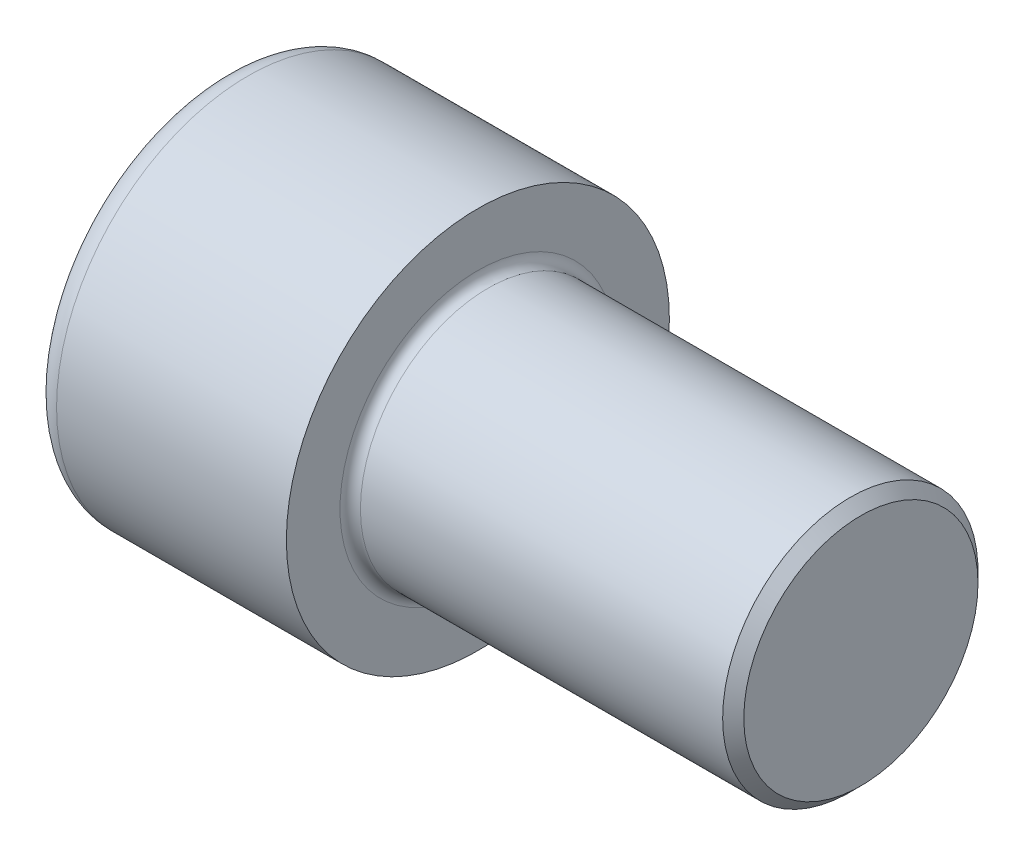
ISO-10303-21;
HEADER;
FILE_DESCRIPTION(('STEP AP214'),'2;1');
FILE_NAME('part.step','',(''),(''),'','','');
FILE_SCHEMA(('AUTOMOTIVE_DESIGN { 1 0 10303 214 1 1 1 1 }'));
ENDSEC;
DATA;
#1=APPLICATION_CONTEXT('core data for automotive mechanical design processes');
#2=APPLICATION_PROTOCOL_DEFINITION('international standard','automotive_design',2000,#1);
#3=PRODUCT_CONTEXT('',#1,'mechanical');
#4=PRODUCT('Part','Part','',(#3));
#5=PRODUCT_RELATED_PRODUCT_CATEGORY('part','',(#4));
#6=PRODUCT_DEFINITION_FORMATION('','',#4);
#7=PRODUCT_DEFINITION_CONTEXT('part definition',#1,'design');
#8=PRODUCT_DEFINITION('design','',#6,#7);
#9=PRODUCT_DEFINITION_SHAPE('','',#8);
#10=(LENGTH_UNIT() NAMED_UNIT(*) SI_UNIT(.MILLI.,.METRE.));
#11=(NAMED_UNIT(*) PLANE_ANGLE_UNIT() SI_UNIT($,.RADIAN.));
#12=(NAMED_UNIT(*) SI_UNIT($,.STERADIAN.) SOLID_ANGLE_UNIT());
#13=UNCERTAINTY_MEASURE_WITH_UNIT(LENGTH_MEASURE(1.E-05),#10,'distance_accuracy_value','');
#14=(GEOMETRIC_REPRESENTATION_CONTEXT(3) GLOBAL_UNCERTAINTY_ASSIGNED_CONTEXT((#13)) GLOBAL_UNIT_ASSIGNED_CONTEXT((#10,
#11,#12)) REPRESENTATION_CONTEXT('',''));
#15=CARTESIAN_POINT('',(0.,0.,0.));
#16=DIRECTION('',(0.,0.,1.));
#17=DIRECTION('',(1.,0.,0.));
#18=AXIS2_PLACEMENT_3D('',#15,#16,#17);
#19=CARTESIAN_POINT('',(-14.6144853716993,11.3751640071104,0.));
#20=DIRECTION('',(-1.,0.,0.));
#21=DIRECTION('',(0.,0.,1.));
#22=AXIS2_PLACEMENT_3D('',#19,#20,#21);
#23=PLANE('',#22);
#24=DIRECTION('',(0.,-0.499999999999999,0.866025403784439));
#25=VECTOR('',#24,1.);
#26=CARTESIAN_POINT('',(-14.6144853716993,21.2189860967935,0.));
#27=LINE('',#26,#25);
#28=CARTESIAN_POINT('',(-14.6144853716993,21.2189860967935,0.));
#29=VERTEX_POINT('',#28);
#30=CARTESIAN_POINT('',(-14.6144853716993,16.297075051952,8.52499999999997));
#31=VERTEX_POINT('',#30);
#32=EDGE_CURVE('E289',#29,#31,#27,.T.);
#33=ORIENTED_EDGE('',*,*,#32,.T.);
#34=DIRECTION('',(0.,1.,0.));
#35=VECTOR('',#34,1.);
#36=CARTESIAN_POINT('',(-14.6144853716993,6.45325296226885,8.52499999999998));
#37=LINE('',#36,#35);
#38=CARTESIAN_POINT('',(-14.6144853716993,6.45325296226885,8.52499999999998));
#39=VERTEX_POINT('',#38);
#40=EDGE_CURVE('E146',#39,#31,#37,.T.);
#41=ORIENTED_EDGE('',*,*,#40,.F.);
#42=DIRECTION('',(0.,-0.500000000000001,-0.866025403784438));
#43=VECTOR('',#42,1.);
#44=CARTESIAN_POINT('',(-14.6144853716993,6.45325296226885,8.52499999999998));
#45=LINE('',#44,#43);
#46=CARTESIAN_POINT('',(-14.6144853716993,1.53134191742728,0.));
#47=VERTEX_POINT('',#46);
#48=EDGE_CURVE('E294',#39,#47,#45,.T.);
#49=ORIENTED_EDGE('',*,*,#48,.T.);
#50=DIRECTION('',(0.,0.499999999999999,-0.866025403784439));
#51=VECTOR('',#50,1.);
#52=CARTESIAN_POINT('',(-14.6144853716993,1.53134191742728,0.));
#53=LINE('',#52,#51);
#54=CARTESIAN_POINT('',(-14.6144853716993,6.45325296226883,-8.52500000000001));
#55=VERTEX_POINT('',#54);
#56=EDGE_CURVE('E298',#47,#55,#53,.T.);
#57=ORIENTED_EDGE('',*,*,#56,.T.);
#58=DIRECTION('',(0.,-1.,0.));
#59=VECTOR('',#58,1.);
#60=CARTESIAN_POINT('',(-14.6144853716993,16.2970750519519,-8.52500000000003));
#61=LINE('',#60,#59);
#62=CARTESIAN_POINT('',(-14.6144853716993,16.2970750519519,-8.52500000000003));
#63=VERTEX_POINT('',#62);
#64=EDGE_CURVE('E302',#63,#55,#61,.T.);
#65=ORIENTED_EDGE('',*,*,#64,.F.);
#66=DIRECTION('',(0.,-0.500000000000001,-0.866025403784438));
#67=VECTOR('',#66,1.);
#68=CARTESIAN_POINT('',(-14.6144853716993,21.2189860967935,0.));
#69=LINE('',#68,#67);
#70=EDGE_CURVE('E141',#29,#63,#69,.T.);
#71=ORIENTED_EDGE('',*,*,#70,.F.);
#72=EDGE_LOOP('',(#33,#41,#49,#57,#65,#71));
#73=FACE_BOUND('',#72,.T.);
#74=CARTESIAN_POINT('',(-14.6144853716993,11.3751640071104,0.));
#75=DIRECTION('',(-1.,0.,0.));
#76=DIRECTION('',(0.,0.,1.));
#77=AXIS2_PLACEMENT_3D('',#74,#75,#76);
#78=CIRCLE('',#77,13.);
#79=CARTESIAN_POINT('',(-14.6144853716993,11.3751640071104,13.));
#80=VERTEX_POINT('',#79);
#81=EDGE_CURVE('E56',#80,#80,#78,.T.);
#82=ORIENTED_EDGE('',*,*,#81,.T.);
#83=EDGE_LOOP('',(#82));
#84=FACE_BOUND('',#83,.T.);
#85=ADVANCED_FACE('F47',(#73,#84),#23,.T.);
#86=CARTESIAN_POINT('',(-46.3644853716993,11.3751640071104,0.));
#87=DIRECTION('',(-1.,0.,0.));
#88=DIRECTION('',(0.,0.,1.));
#89=AXIS2_PLACEMENT_3D('',#86,#87,#88);
#90=CYLINDRICAL_SURFACE('',#89,15.);
#91=CARTESIAN_POINT('',(-12.6144853716993,11.3751640071104,0.));
#92=DIRECTION('',(-1.,0.,0.));
#93=DIRECTION('',(0.,0.,1.));
#94=AXIS2_PLACEMENT_3D('',#91,#92,#93);
#95=CIRCLE('',#94,15.);
#96=CARTESIAN_POINT('',(-12.6144853716993,11.3751640071104,15.));
#97=VERTEX_POINT('',#96);
#98=EDGE_CURVE('E11',#97,#97,#95,.F.);
#99=ORIENTED_EDGE('',*,*,#98,.T.);
#100=EDGE_LOOP('',(#99));
#101=FACE_BOUND('',#100,.T.);
#102=CARTESIAN_POINT('',(5.38551462830068,11.3751640071104,0.));
#103=DIRECTION('',(-1.,0.,0.));
#104=DIRECTION('',(0.,0.,1.));
#105=AXIS2_PLACEMENT_3D('',#102,#103,#104);
#106=CIRCLE('',#105,15.);
#107=CARTESIAN_POINT('',(5.38551462830068,11.3751640071104,15.));
#108=VERTEX_POINT('',#107);
#109=EDGE_CURVE('E170',#108,#108,#106,.T.);
#110=ORIENTED_EDGE('',*,*,#109,.T.);
#111=EDGE_LOOP('',(#110));
#112=FACE_BOUND('',#111,.T.);
#113=ADVANCED_FACE('F198',(#101,#112),#90,.T.);
#114=CARTESIAN_POINT('',(5.38551462830068,26.3751640071104,0.));
#115=DIRECTION('',(1.,0.,0.));
#116=DIRECTION('',(0.,0.,-1.));
#117=AXIS2_PLACEMENT_3D('',#114,#115,#116);
#118=PLANE('',#117);
#119=CARTESIAN_POINT('',(5.38551462830068,11.3751640071104,0.));
#120=DIRECTION('',(1.,0.,0.));
#121=DIRECTION('',(0.,0.,-1.));
#122=AXIS2_PLACEMENT_3D('',#119,#120,#121);
#123=CIRCLE('',#122,10.8);
#124=CARTESIAN_POINT('',(5.38551462830068,11.3751640071104,-10.8));
#125=VERTEX_POINT('',#124);
#126=EDGE_CURVE('E174',#125,#125,#123,.F.);
#127=ORIENTED_EDGE('',*,*,#126,.T.);
#128=EDGE_LOOP('',(#127));
#129=FACE_BOUND('',#128,.T.);
#130=ORIENTED_EDGE('',*,*,#109,.F.);
#131=EDGE_LOOP('',(#130));
#132=FACE_BOUND('',#131,.T.);
#133=ADVANCED_FACE('F204',(#129,#132),#118,.T.);
#134=CARTESIAN_POINT('',(-46.3644853716993,11.3751640071104,0.));
#135=DIRECTION('',(-1.,0.,0.));
#136=DIRECTION('',(0.,0.,1.));
#137=AXIS2_PLACEMENT_3D('',#134,#135,#136);
#138=CYLINDRICAL_SURFACE('',#137,10.);
#139=CARTESIAN_POINT('',(6.18551462830068,11.3751640071104,0.));
#140=DIRECTION('',(1.,0.,0.));
#141=DIRECTION('',(0.,0.,-1.));
#142=AXIS2_PLACEMENT_3D('',#139,#140,#141);
#143=CIRCLE('',#142,10.);
#144=CARTESIAN_POINT('',(6.18551462830068,11.3751640071104,-10.));
#145=VERTEX_POINT('',#144);
#146=EDGE_CURVE('E178',#145,#145,#143,.T.);
#147=ORIENTED_EDGE('',*,*,#146,.T.);
#148=EDGE_LOOP('',(#147));
#149=FACE_BOUND('',#148,.T.);
#150=CARTESIAN_POINT('',(34.5575146283007,11.3751640071104,0.));
#151=DIRECTION('',(-1.,0.,0.));
#152=DIRECTION('',(0.,0.,1.));
#153=AXIS2_PLACEMENT_3D('',#150,#151,#152);
#154=CIRCLE('',#153,10.);
#155=CARTESIAN_POINT('',(34.5575146283007,11.3751640071104,9.99999999999998));
#156=VERTEX_POINT('',#155);
#157=EDGE_CURVE('E166',#156,#156,#154,.T.);
#158=ORIENTED_EDGE('',*,*,#157,.T.);
#159=EDGE_LOOP('',(#158));
#160=FACE_BOUND('',#159,.T.);
#161=ADVANCED_FACE('F210',(#149,#160),#138,.T.);
#162=CARTESIAN_POINT('',(35.3855146283007,11.3751640071104,0.));
#163=DIRECTION('',(-1.,0.,0.));
#164=DIRECTION('',(0.,0.,1.));
#165=AXIS2_PLACEMENT_3D('',#162,#163,#164);
#166=CONICAL_SURFACE('',#165,9.172,0.78539816339745);
#167=ORIENTED_EDGE('',*,*,#157,.F.);
#168=EDGE_LOOP('',(#167));
#169=FACE_BOUND('',#168,.T.);
#170=CARTESIAN_POINT('',(35.3855146283007,11.3751640071104,0.));
#171=DIRECTION('',(-1.,0.,0.));
#172=DIRECTION('',(0.,0.,1.));
#173=AXIS2_PLACEMENT_3D('',#170,#171,#172);
#174=CIRCLE('',#173,9.172);
#175=CARTESIAN_POINT('',(35.3855146283007,11.3751640071104,9.17199999999998));
#176=VERTEX_POINT('',#175);
#177=EDGE_CURVE('E161',#176,#176,#174,.T.);
#178=ORIENTED_EDGE('',*,*,#177,.T.);
#179=EDGE_LOOP('',(#178));
#180=FACE_BOUND('',#179,.T.);
#181=ADVANCED_FACE('F214',(#169,#180),#166,.T.);
#182=CARTESIAN_POINT('',(35.3855146283007,20.5471640071104,0.));
#183=DIRECTION('',(1.,0.,0.));
#184=DIRECTION('',(0.,0.,-1.));
#185=AXIS2_PLACEMENT_3D('',#182,#183,#184);
#186=PLANE('',#185);
#187=ORIENTED_EDGE('',*,*,#177,.F.);
#188=EDGE_LOOP('',(#187));
#189=FACE_BOUND('',#188,.T.);
#190=ADVANCED_FACE('F194',(#189),#186,.T.);
#191=CARTESIAN_POINT('',(6.18551462830068,11.3751640071104,0.));
#192=DIRECTION('',(1.,0.,0.));
#193=DIRECTION('',(0.,0.,-1.));
#194=AXIS2_PLACEMENT_3D('',#191,#192,#193);
#195=TOROIDAL_SURFACE('',#194,10.8,0.8);
#196=ORIENTED_EDGE('',*,*,#146,.F.);
#197=EDGE_LOOP('',(#196));
#198=FACE_BOUND('',#197,.T.);
#199=ORIENTED_EDGE('',*,*,#126,.F.);
#200=EDGE_LOOP('',(#199));
#201=FACE_BOUND('',#200,.T.);
#202=ADVANCED_FACE('F187',(#198,#201),#195,.F.);
#203=CARTESIAN_POINT('',(-12.6144853716993,11.3751640071104,0.));
#204=DIRECTION('',(-1.,0.,0.));
#205=DIRECTION('',(0.,0.,1.));
#206=AXIS2_PLACEMENT_3D('',#203,#204,#205);
#207=TOROIDAL_SURFACE('',#206,13.,2.);
#208=ORIENTED_EDGE('',*,*,#98,.F.);
#209=EDGE_LOOP('',(#208));
#210=FACE_BOUND('',#209,.T.);
#211=ORIENTED_EDGE('',*,*,#81,.F.);
#212=EDGE_LOOP('',(#211));
#213=FACE_BOUND('',#212,.T.);
#214=ADVANCED_FACE('F49',(#210,#213),#207,.T.);
#215=CARTESIAN_POINT('',(-4.61448537169932,21.2189860967935,0.));
#216=DIRECTION('',(0.,-0.866025403784439,-0.499999999999999));
#217=DIRECTION('',(0.,0.499999999999999,-0.866025403784439));
#218=AXIS2_PLACEMENT_3D('',#215,#216,#217);
#219=PLANE('',#218);
#220=ORIENTED_EDGE('',*,*,#32,.F.);
#221=DIRECTION('',(-1.,0.,0.));
#222=VECTOR('',#221,1.);
#223=CARTESIAN_POINT('',(-4.61448537169932,21.2189860967935,0.));
#224=LINE('',#223,#222);
#225=CARTESIAN_POINT('',(-4.61448537169932,21.2189860967935,0.));
#226=VERTEX_POINT('',#225);
#227=EDGE_CURVE('E276',#226,#29,#224,.T.);
#228=ORIENTED_EDGE('',*,*,#227,.F.);
#229=DIRECTION('',(0.,-0.499999999999999,0.866025403784439));
#230=VECTOR('',#229,1.);
#231=CARTESIAN_POINT('',(-4.61448537169932,21.2189860967935,0.));
#232=LINE('',#231,#230);
#233=CARTESIAN_POINT('',(-4.61448537169932,18.7580305743727,4.26249999999997));
#234=VERTEX_POINT('',#233);
#235=EDGE_CURVE('E132',#226,#234,#232,.T.);
#236=ORIENTED_EDGE('',*,*,#235,.T.);
#237=CARTESIAN_POINT('',(-4.61448537169932,16.297075051952,8.52499999999997));
#238=VERTEX_POINT('',#237);
#239=EDGE_CURVE('E122',#234,#238,#232,.T.);
#240=ORIENTED_EDGE('',*,*,#239,.T.);
#241=DIRECTION('',(-1.,0.,0.));
#242=VECTOR('',#241,1.);
#243=CARTESIAN_POINT('',(-4.61448537169932,16.297075051952,8.52499999999997));
#244=LINE('',#243,#242);
#245=EDGE_CURVE('E137',#238,#31,#244,.T.);
#246=ORIENTED_EDGE('',*,*,#245,.T.);
#247=EDGE_LOOP('',(#220,#228,#236,#240,#246));
#248=FACE_BOUND('',#247,.T.);
#249=ADVANCED_FACE('F136',(#248),#219,.T.);
#250=CARTESIAN_POINT('',(-4.61448537169932,6.45325296226885,8.52499999999998));
#251=DIRECTION('',(0.,0.,1.));
#252=DIRECTION('',(0.,-1.,0.));
#253=AXIS2_PLACEMENT_3D('',#250,#251,#252);
#254=PLANE('',#253);
#255=ORIENTED_EDGE('',*,*,#40,.T.);
#256=ORIENTED_EDGE('',*,*,#245,.F.);
#257=DIRECTION('',(0.,1.,0.));
#258=VECTOR('',#257,1.);
#259=CARTESIAN_POINT('',(-4.61448537169932,6.45325296226885,8.52499999999998));
#260=LINE('',#259,#258);
#261=CARTESIAN_POINT('',(-4.61448537169932,11.3751640071104,8.52499999999998));
#262=VERTEX_POINT('',#261);
#263=EDGE_CURVE('E119',#262,#238,#260,.T.);
#264=ORIENTED_EDGE('',*,*,#263,.F.);
#265=CARTESIAN_POINT('',(-4.61448537169932,6.45325296226885,8.52499999999998));
#266=VERTEX_POINT('',#265);
#267=EDGE_CURVE('E131',#266,#262,#260,.T.);
#268=ORIENTED_EDGE('',*,*,#267,.F.);
#269=DIRECTION('',(-1.,0.,0.));
#270=VECTOR('',#269,1.);
#271=CARTESIAN_POINT('',(-4.61448537169932,6.45325296226885,8.52499999999998));
#272=LINE('',#271,#270);
#273=EDGE_CURVE('E149',#266,#39,#272,.T.);
#274=ORIENTED_EDGE('',*,*,#273,.T.);
#275=EDGE_LOOP('',(#255,#256,#264,#268,#274));
#276=FACE_BOUND('',#275,.T.);
#277=ADVANCED_FACE('F143',(#276),#254,.F.);
#278=CARTESIAN_POINT('',(-4.61448537169932,6.45325296226885,8.52499999999998));
#279=DIRECTION('',(0.,0.866025403784438,-0.500000000000001));
#280=DIRECTION('',(0.,0.500000000000001,0.866025403784438));
#281=AXIS2_PLACEMENT_3D('',#278,#279,#280);
#282=PLANE('',#281);
#283=ORIENTED_EDGE('',*,*,#48,.F.);
#284=ORIENTED_EDGE('',*,*,#273,.F.);
#285=DIRECTION('',(0.,-0.500000000000001,-0.866025403784438));
#286=VECTOR('',#285,1.);
#287=CARTESIAN_POINT('',(-4.61448537169932,6.45325296226885,8.52499999999998));
#288=LINE('',#287,#286);
#289=CARTESIAN_POINT('',(-4.61448537169932,3.99229743984807,4.26249999999999));
#290=VERTEX_POINT('',#289);
#291=EDGE_CURVE('E332',#266,#290,#288,.T.);
#292=ORIENTED_EDGE('',*,*,#291,.T.);
#293=CARTESIAN_POINT('',(-4.61448537169932,1.53134191742728,0.));
#294=VERTEX_POINT('',#293);
#295=EDGE_CURVE('E316',#290,#294,#288,.T.);
#296=ORIENTED_EDGE('',*,*,#295,.T.);
#297=DIRECTION('',(-1.,0.,0.));
#298=VECTOR('',#297,1.);
#299=CARTESIAN_POINT('',(-4.61448537169932,1.53134191742728,0.));
#300=LINE('',#299,#298);
#301=EDGE_CURVE('E156',#294,#47,#300,.T.);
#302=ORIENTED_EDGE('',*,*,#301,.T.);
#303=EDGE_LOOP('',(#283,#284,#292,#296,#302));
#304=FACE_BOUND('',#303,.T.);
#305=ADVANCED_FACE('F228',(#304),#282,.T.);
#306=CARTESIAN_POINT('',(-4.61448537169932,1.53134191742728,0.));
#307=DIRECTION('',(0.,0.866025403784439,0.499999999999999));
#308=DIRECTION('',(0.,-0.499999999999999,0.866025403784439));
#309=AXIS2_PLACEMENT_3D('',#306,#307,#308);
#310=PLANE('',#309);
#311=ORIENTED_EDGE('',*,*,#56,.F.);
#312=ORIENTED_EDGE('',*,*,#301,.F.);
#313=DIRECTION('',(0.,0.499999999999999,-0.866025403784439));
#314=VECTOR('',#313,1.);
#315=CARTESIAN_POINT('',(-4.61448537169932,1.53134191742728,0.));
#316=LINE('',#315,#314);
#317=CARTESIAN_POINT('',(-4.61448537169932,3.99229743984805,-4.26250000000001));
#318=VERTEX_POINT('',#317);
#319=EDGE_CURVE('E284',#294,#318,#316,.T.);
#320=ORIENTED_EDGE('',*,*,#319,.T.);
#321=CARTESIAN_POINT('',(-4.61448537169932,6.45325296226883,-8.52500000000001));
#322=VERTEX_POINT('',#321);
#323=EDGE_CURVE('E330',#318,#322,#316,.T.);
#324=ORIENTED_EDGE('',*,*,#323,.T.);
#325=DIRECTION('',(-1.,0.,0.));
#326=VECTOR('',#325,1.);
#327=CARTESIAN_POINT('',(-4.61448537169932,6.45325296226883,-8.52500000000001));
#328=LINE('',#327,#326);
#329=EDGE_CURVE('E275',#322,#55,#328,.T.);
#330=ORIENTED_EDGE('',*,*,#329,.T.);
#331=EDGE_LOOP('',(#311,#312,#320,#324,#330));
#332=FACE_BOUND('',#331,.T.);
#333=ADVANCED_FACE('F231',(#332),#310,.T.);
#334=CARTESIAN_POINT('',(-4.61448537169932,16.2970750519519,-8.52500000000003));
#335=DIRECTION('',(0.,0.,-1.));
#336=DIRECTION('',(0.,1.,0.));
#337=AXIS2_PLACEMENT_3D('',#334,#335,#336);
#338=PLANE('',#337);
#339=ORIENTED_EDGE('',*,*,#64,.T.);
#340=ORIENTED_EDGE('',*,*,#329,.F.);
#341=DIRECTION('',(0.,-1.,0.));
#342=VECTOR('',#341,1.);
#343=CARTESIAN_POINT('',(-4.61448537169932,16.2970750519519,-8.52500000000003));
#344=LINE('',#343,#342);
#345=CARTESIAN_POINT('',(-4.61448537169932,11.3751640071104,-8.52500000000002));
#346=VERTEX_POINT('',#345);
#347=EDGE_CURVE('E279',#346,#322,#344,.T.);
#348=ORIENTED_EDGE('',*,*,#347,.F.);
#349=CARTESIAN_POINT('',(-4.61448537169932,16.2970750519519,-8.52500000000003));
#350=VERTEX_POINT('',#349);
#351=EDGE_CURVE('E63',#350,#346,#344,.T.);
#352=ORIENTED_EDGE('',*,*,#351,.F.);
#353=DIRECTION('',(-1.,0.,0.));
#354=VECTOR('',#353,1.);
#355=CARTESIAN_POINT('',(-4.61448537169932,16.2970750519519,-8.52500000000003));
#356=LINE('',#355,#354);
#357=EDGE_CURVE('E271',#350,#63,#356,.T.);
#358=ORIENTED_EDGE('',*,*,#357,.T.);
#359=EDGE_LOOP('',(#339,#340,#348,#352,#358));
#360=FACE_BOUND('',#359,.T.);
#361=ADVANCED_FACE('F235',(#360),#338,.F.);
#362=CARTESIAN_POINT('',(-4.61448537169932,21.2189860967935,0.));
#363=DIRECTION('',(0.,0.866025403784438,-0.500000000000001));
#364=DIRECTION('',(0.,0.500000000000001,0.866025403784438));
#365=AXIS2_PLACEMENT_3D('',#362,#363,#364);
#366=PLANE('',#365);
#367=ORIENTED_EDGE('',*,*,#70,.T.);
#368=ORIENTED_EDGE('',*,*,#357,.F.);
#369=DIRECTION('',(0.,-0.500000000000001,-0.866025403784438));
#370=VECTOR('',#369,1.);
#371=CARTESIAN_POINT('',(-4.61448537169932,21.2189860967935,0.));
#372=LINE('',#371,#370);
#373=CARTESIAN_POINT('',(-4.61448537169932,18.7580305743727,-4.26250000000003));
#374=VERTEX_POINT('',#373);
#375=EDGE_CURVE('E260',#374,#350,#372,.T.);
#376=ORIENTED_EDGE('',*,*,#375,.F.);
#377=EDGE_CURVE('E267',#226,#374,#372,.T.);
#378=ORIENTED_EDGE('',*,*,#377,.F.);
#379=ORIENTED_EDGE('',*,*,#227,.T.);
#380=EDGE_LOOP('',(#367,#368,#376,#378,#379));
#381=FACE_BOUND('',#380,.T.);
#382=ADVANCED_FACE('F239',(#381),#366,.F.);
#383=CARTESIAN_POINT('',(-4.61448537169932,21.2189860967935,0.));
#384=DIRECTION('',(1.,0.,0.));
#385=DIRECTION('',(0.,0.,-1.));
#386=AXIS2_PLACEMENT_3D('',#383,#384,#385);
#387=PLANE('',#386);
#388=ORIENTED_EDGE('',*,*,#347,.T.);
#389=ORIENTED_EDGE('',*,*,#323,.F.);
#390=CARTESIAN_POINT('',(-4.61448537169932,11.3751640071104,0.));
#391=DIRECTION('',(-1.,0.,0.));
#392=DIRECTION('',(0.,0.,1.));
#393=AXIS2_PLACEMENT_3D('',#390,#391,#392);
#394=CIRCLE('',#393,8.525);
#395=EDGE_CURVE('E324',#346,#318,#394,.T.);
#396=ORIENTED_EDGE('',*,*,#395,.F.);
#397=EDGE_LOOP('',(#388,#389,#396));
#398=FACE_BOUND('',#397,.T.);
#399=ADVANCED_FACE('F243',(#398),#387,.F.);
#400=ORIENTED_EDGE('',*,*,#319,.F.);
#401=ORIENTED_EDGE('',*,*,#295,.F.);
#402=EDGE_CURVE('E154',#318,#290,#394,.T.);
#403=ORIENTED_EDGE('',*,*,#402,.F.);
#404=EDGE_LOOP('',(#400,#401,#403));
#405=FACE_BOUND('',#404,.T.);
#406=ADVANCED_FACE('F246',(#405),#387,.F.);
#407=ORIENTED_EDGE('',*,*,#291,.F.);
#408=ORIENTED_EDGE('',*,*,#267,.T.);
#409=EDGE_CURVE('E148',#290,#262,#394,.T.);
#410=ORIENTED_EDGE('',*,*,#409,.F.);
#411=EDGE_LOOP('',(#407,#408,#410));
#412=FACE_BOUND('',#411,.T.);
#413=ADVANCED_FACE('F251',(#412),#387,.F.);
#414=ORIENTED_EDGE('',*,*,#263,.T.);
#415=ORIENTED_EDGE('',*,*,#239,.F.);
#416=EDGE_CURVE('E125',#262,#234,#394,.T.);
#417=ORIENTED_EDGE('',*,*,#416,.F.);
#418=EDGE_LOOP('',(#414,#415,#417));
#419=FACE_BOUND('',#418,.T.);
#420=ADVANCED_FACE('F121',(#419),#387,.F.);
#421=ORIENTED_EDGE('',*,*,#235,.F.);
#422=ORIENTED_EDGE('',*,*,#377,.T.);
#423=EDGE_CURVE('E162',#234,#374,#394,.T.);
#424=ORIENTED_EDGE('',*,*,#423,.F.);
#425=EDGE_LOOP('',(#421,#422,#424));
#426=FACE_BOUND('',#425,.T.);
#427=ADVANCED_FACE('F254',(#426),#387,.F.);
#428=ORIENTED_EDGE('',*,*,#375,.T.);
#429=ORIENTED_EDGE('',*,*,#351,.T.);
#430=EDGE_CURVE('E263',#374,#346,#394,.T.);
#431=ORIENTED_EDGE('',*,*,#430,.F.);
#432=EDGE_LOOP('',(#428,#429,#431));
#433=FACE_BOUND('',#432,.T.);
#434=ADVANCED_FACE('F224',(#433),#387,.F.);
#435=CARTESIAN_POINT('',(-4.61448537169932,11.3751640071104,0.));
#436=DIRECTION('',(-1.,0.,0.));
#437=DIRECTION('',(0.,0.,1.));
#438=AXIS2_PLACEMENT_3D('',#435,#436,#437);
#439=CONICAL_SURFACE('',#438,8.525,1.04719755119659);
#440=CARTESIAN_POINT('',(0.307425673142299,11.3751640071104,0.));
#441=VERTEX_POINT('',#440);
#442=VERTEX_LOOP('',#441);
#443=FACE_BOUND('',#442,.T.);
#444=ORIENTED_EDGE('',*,*,#416,.T.);
#445=ORIENTED_EDGE('',*,*,#423,.T.);
#446=ORIENTED_EDGE('',*,*,#430,.T.);
#447=ORIENTED_EDGE('',*,*,#395,.T.);
#448=ORIENTED_EDGE('',*,*,#402,.T.);
#449=ORIENTED_EDGE('',*,*,#409,.T.);
#450=EDGE_LOOP('',(#444,#445,#446,#447,#448,#449));
#451=FACE_BOUND('',#450,.T.);
#452=ADVANCED_FACE('F222',(#443,#451),#439,.F.);
#453=CLOSED_SHELL('',(#85,#113,#133,#161,#181,#190,#202,#214,#249,#277,#305,#333,#361,#382,#399,
#406,#413,#420,#427,#434,#452));
#454=MANIFOLD_SOLID_BREP('B2',#453);
#455=ADVANCED_BREP_SHAPE_REPRESENTATION('',(#18,#454),#14);
#456=SHAPE_DEFINITION_REPRESENTATION(#9,#455);
ENDSEC;
END-ISO-10303-21;
